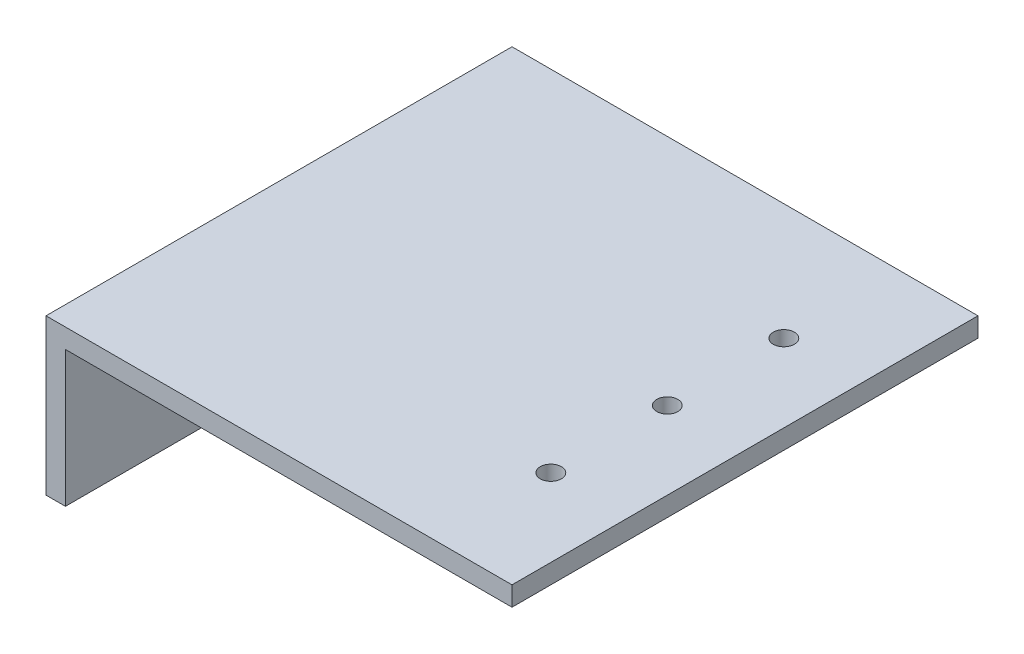
ISO-10303-21;
HEADER;
FILE_DESCRIPTION(('STEP AP214'),'2;1');
FILE_NAME('part.step','',(''),(''),'','','');
FILE_SCHEMA(('AUTOMOTIVE_DESIGN { 1 0 10303 214 1 1 1 1 }'));
ENDSEC;
DATA;
#1=APPLICATION_CONTEXT('core data for automotive mechanical design processes');
#2=APPLICATION_PROTOCOL_DEFINITION('international standard','automotive_design',2000,#1);
#3=PRODUCT_CONTEXT('',#1,'mechanical');
#4=PRODUCT('Part','Part','',(#3));
#5=PRODUCT_RELATED_PRODUCT_CATEGORY('part','',(#4));
#6=PRODUCT_DEFINITION_FORMATION('','',#4);
#7=PRODUCT_DEFINITION_CONTEXT('part definition',#1,'design');
#8=PRODUCT_DEFINITION('design','',#6,#7);
#9=PRODUCT_DEFINITION_SHAPE('','',#8);
#10=(LENGTH_UNIT() NAMED_UNIT(*) SI_UNIT(.MILLI.,.METRE.));
#11=(NAMED_UNIT(*) PLANE_ANGLE_UNIT() SI_UNIT($,.RADIAN.));
#12=(NAMED_UNIT(*) SI_UNIT($,.STERADIAN.) SOLID_ANGLE_UNIT());
#13=UNCERTAINTY_MEASURE_WITH_UNIT(LENGTH_MEASURE(1.E-05),#10,'distance_accuracy_value','');
#14=(GEOMETRIC_REPRESENTATION_CONTEXT(3) GLOBAL_UNCERTAINTY_ASSIGNED_CONTEXT((#13)) GLOBAL_UNIT_ASSIGNED_CONTEXT((#10,
#11,#12)) REPRESENTATION_CONTEXT('',''));
#15=CARTESIAN_POINT('',(0.,0.,0.));
#16=DIRECTION('',(0.,0.,1.));
#17=DIRECTION('',(1.,0.,0.));
#18=AXIS2_PLACEMENT_3D('',#15,#16,#17);
#19=CARTESIAN_POINT('',(0.,0.,76.2));
#20=DIRECTION('',(0.,-1.,0.));
#21=DIRECTION('',(1.,0.,0.));
#22=AXIS2_PLACEMENT_3D('',#19,#20,#21);
#23=PLANE('',#22);
#24=DIRECTION('',(-1.,0.,0.));
#25=VECTOR('',#24,1.);
#26=CARTESIAN_POINT('',(0.,0.,0.));
#27=LINE('',#26,#25);
#28=CARTESIAN_POINT('',(0.,0.,0.));
#29=VERTEX_POINT('',#28);
#30=CARTESIAN_POINT('',(-76.2,0.,0.));
#31=VERTEX_POINT('',#30);
#32=EDGE_CURVE('E120',#29,#31,#27,.T.);
#33=ORIENTED_EDGE('',*,*,#32,.T.);
#34=DIRECTION('',(0.,0.,-1.));
#35=VECTOR('',#34,1.);
#36=CARTESIAN_POINT('',(-76.2,0.,76.2));
#37=LINE('',#36,#35);
#38=CARTESIAN_POINT('',(-76.2,0.,76.2));
#39=VERTEX_POINT('',#38);
#40=EDGE_CURVE('E41',#39,#31,#37,.T.);
#41=ORIENTED_EDGE('',*,*,#40,.F.);
#42=DIRECTION('',(-1.,0.,0.));
#43=VECTOR('',#42,1.);
#44=CARTESIAN_POINT('',(0.,0.,76.2));
#45=LINE('',#44,#43);
#46=CARTESIAN_POINT('',(0.,0.,76.2));
#47=VERTEX_POINT('',#46);
#48=EDGE_CURVE('E86',#47,#39,#45,.T.);
#49=ORIENTED_EDGE('',*,*,#48,.F.);
#50=DIRECTION('',(0.,0.,-1.));
#51=VECTOR('',#50,1.);
#52=CARTESIAN_POINT('',(0.,0.,76.2));
#53=LINE('',#52,#51);
#54=EDGE_CURVE('E11',#47,#29,#53,.T.);
#55=ORIENTED_EDGE('',*,*,#54,.T.);
#56=EDGE_LOOP('',(#33,#41,#49,#55));
#57=FACE_BOUND('',#56,.T.);
#58=CARTESIAN_POINT('',(-12.7,0.,57.15));
#59=DIRECTION('',(0.,1.,0.));
#60=DIRECTION('',(0.,0.,1.));
#61=AXIS2_PLACEMENT_3D('',#58,#59,#60);
#62=CIRCLE('',#61,1.7272);
#63=CARTESIAN_POINT('',(-12.7,0.,58.8772));
#64=VERTEX_POINT('',#63);
#65=EDGE_CURVE('E278',#64,#64,#62,.T.);
#66=ORIENTED_EDGE('',*,*,#65,.F.);
#67=EDGE_LOOP('',(#66));
#68=FACE_BOUND('',#67,.T.);
#69=CARTESIAN_POINT('',(-12.7,0.,19.05));
#70=DIRECTION('',(0.,1.,0.));
#71=DIRECTION('',(0.,0.,1.));
#72=AXIS2_PLACEMENT_3D('',#69,#70,#71);
#73=CIRCLE('',#72,1.7272);
#74=CARTESIAN_POINT('',(-12.7,0.,20.7772));
#75=VERTEX_POINT('',#74);
#76=EDGE_CURVE('E284',#75,#75,#73,.T.);
#77=ORIENTED_EDGE('',*,*,#76,.F.);
#78=EDGE_LOOP('',(#77));
#79=FACE_BOUND('',#78,.T.);
#80=CARTESIAN_POINT('',(-12.7,0.,38.1));
#81=DIRECTION('',(0.,1.,0.));
#82=DIRECTION('',(0.,0.,1.));
#83=AXIS2_PLACEMENT_3D('',#80,#81,#82);
#84=CIRCLE('',#83,1.7272);
#85=CARTESIAN_POINT('',(-12.7,0.,39.8272));
#86=VERTEX_POINT('',#85);
#87=EDGE_CURVE('E289',#86,#86,#84,.T.);
#88=ORIENTED_EDGE('',*,*,#87,.F.);
#89=EDGE_LOOP('',(#88));
#90=FACE_BOUND('',#89,.T.);
#91=ADVANCED_FACE('F32',(#57,#68,#79,#90),#23,.F.);
#92=CARTESIAN_POINT('',(0.,-3.17500000000001,76.2));
#93=DIRECTION('',(-1.,0.,0.));
#94=DIRECTION('',(0.,0.,1.));
#95=AXIS2_PLACEMENT_3D('',#92,#93,#94);
#96=PLANE('',#95);
#97=DIRECTION('',(0.,1.,0.));
#98=VECTOR('',#97,1.);
#99=CARTESIAN_POINT('',(0.,-3.17500000000001,0.));
#100=LINE('',#99,#98);
#101=CARTESIAN_POINT('',(0.,-3.17500000000001,0.));
#102=VERTEX_POINT('',#101);
#103=EDGE_CURVE('E117',#102,#29,#100,.T.);
#104=ORIENTED_EDGE('',*,*,#103,.T.);
#105=ORIENTED_EDGE('',*,*,#54,.F.);
#106=DIRECTION('',(0.,1.,0.));
#107=VECTOR('',#106,1.);
#108=CARTESIAN_POINT('',(0.,-3.17500000000001,76.2));
#109=LINE('',#108,#107);
#110=CARTESIAN_POINT('',(0.,-3.17500000000001,76.2));
#111=VERTEX_POINT('',#110);
#112=EDGE_CURVE('E128',#111,#47,#109,.T.);
#113=ORIENTED_EDGE('',*,*,#112,.F.);
#114=DIRECTION('',(0.,0.,-1.));
#115=VECTOR('',#114,1.);
#116=CARTESIAN_POINT('',(0.,-3.17500000000001,76.2));
#117=LINE('',#116,#115);
#118=EDGE_CURVE('E113',#111,#102,#117,.T.);
#119=ORIENTED_EDGE('',*,*,#118,.T.);
#120=EDGE_LOOP('',(#104,#105,#113,#119));
#121=FACE_BOUND('',#120,.T.);
#122=ADVANCED_FACE('F34',(#121),#96,.F.);
#123=CARTESIAN_POINT('',(-76.2,0.,76.2));
#124=DIRECTION('',(1.,0.,0.));
#125=DIRECTION('',(0.,0.,-1.));
#126=AXIS2_PLACEMENT_3D('',#123,#124,#125);
#127=PLANE('',#126);
#128=CARTESIAN_POINT('',(-76.2,-15.24,25.4));
#129=DIRECTION('',(-1.,0.,0.));
#130=DIRECTION('',(0.,0.,1.));
#131=AXIS2_PLACEMENT_3D('',#128,#129,#130);
#132=CIRCLE('',#131,1.72719999999999);
#133=CARTESIAN_POINT('',(-76.2,-15.24,27.1272));
#134=VERTEX_POINT('',#133);
#135=EDGE_CURVE('E301',#134,#134,#132,.T.);
#136=ORIENTED_EDGE('',*,*,#135,.F.);
#137=EDGE_LOOP('',(#136));
#138=FACE_BOUND('',#137,.T.);
#139=CARTESIAN_POINT('',(-76.2,-15.24,50.8));
#140=DIRECTION('',(-1.,0.,0.));
#141=DIRECTION('',(0.,0.,1.));
#142=AXIS2_PLACEMENT_3D('',#139,#140,#141);
#143=CIRCLE('',#142,1.72719999999999);
#144=CARTESIAN_POINT('',(-76.2,-15.24,52.5272));
#145=VERTEX_POINT('',#144);
#146=EDGE_CURVE('E295',#145,#145,#143,.T.);
#147=ORIENTED_EDGE('',*,*,#146,.F.);
#148=EDGE_LOOP('',(#147));
#149=FACE_BOUND('',#148,.T.);
#150=CARTESIAN_POINT('',(-76.2,-15.24,38.1));
#151=DIRECTION('',(-1.,0.,0.));
#152=DIRECTION('',(0.,0.,1.));
#153=AXIS2_PLACEMENT_3D('',#150,#151,#152);
#154=CIRCLE('',#153,3.175);
#155=CARTESIAN_POINT('',(-76.2,-15.24,41.275));
#156=VERTEX_POINT('',#155);
#157=EDGE_CURVE('E266',#156,#156,#154,.T.);
#158=ORIENTED_EDGE('',*,*,#157,.F.);
#159=EDGE_LOOP('',(#158));
#160=FACE_BOUND('',#159,.T.);
#161=DIRECTION('',(0.,-1.,0.));
#162=VECTOR('',#161,1.);
#163=CARTESIAN_POINT('',(-76.2,0.,0.));
#164=LINE('',#163,#162);
#165=CARTESIAN_POINT('',(-76.2,-25.4,0.));
#166=VERTEX_POINT('',#165);
#167=EDGE_CURVE('E123',#31,#166,#164,.T.);
#168=ORIENTED_EDGE('',*,*,#167,.T.);
#169=DIRECTION('',(0.,0.,-1.));
#170=VECTOR('',#169,1.);
#171=CARTESIAN_POINT('',(-76.2,-25.4,76.2));
#172=LINE('',#171,#170);
#173=CARTESIAN_POINT('',(-76.2,-25.4,76.2));
#174=VERTEX_POINT('',#173);
#175=EDGE_CURVE('E108',#174,#166,#172,.T.);
#176=ORIENTED_EDGE('',*,*,#175,.F.);
#177=DIRECTION('',(0.,-1.,0.));
#178=VECTOR('',#177,1.);
#179=CARTESIAN_POINT('',(-76.2,0.,76.2));
#180=LINE('',#179,#178);
#181=EDGE_CURVE('E99',#39,#174,#180,.T.);
#182=ORIENTED_EDGE('',*,*,#181,.F.);
#183=ORIENTED_EDGE('',*,*,#40,.T.);
#184=EDGE_LOOP('',(#168,#176,#182,#183));
#185=FACE_BOUND('',#184,.T.);
#186=ADVANCED_FACE('F134',(#138,#149,#160,#185),#127,.F.);
#187=CARTESIAN_POINT('',(-76.2,-25.4,76.2));
#188=DIRECTION('',(0.,1.,0.));
#189=DIRECTION('',(0.,0.,1.));
#190=AXIS2_PLACEMENT_3D('',#187,#188,#189);
#191=PLANE('',#190);
#192=DIRECTION('',(1.,0.,0.));
#193=VECTOR('',#192,1.);
#194=CARTESIAN_POINT('',(-76.2,-25.4,0.));
#195=LINE('',#194,#193);
#196=CARTESIAN_POINT('',(-73.025,-25.4,0.));
#197=VERTEX_POINT('',#196);
#198=EDGE_CURVE('E107',#166,#197,#195,.T.);
#199=ORIENTED_EDGE('',*,*,#198,.T.);
#200=DIRECTION('',(0.,0.,-1.));
#201=VECTOR('',#200,1.);
#202=CARTESIAN_POINT('',(-73.025,-25.4,76.2));
#203=LINE('',#202,#201);
#204=CARTESIAN_POINT('',(-73.025,-25.4,76.2));
#205=VERTEX_POINT('',#204);
#206=EDGE_CURVE('E104',#205,#197,#203,.T.);
#207=ORIENTED_EDGE('',*,*,#206,.F.);
#208=DIRECTION('',(1.,0.,0.));
#209=VECTOR('',#208,1.);
#210=CARTESIAN_POINT('',(-76.2,-25.4,76.2));
#211=LINE('',#210,#209);
#212=EDGE_CURVE('E93',#174,#205,#211,.T.);
#213=ORIENTED_EDGE('',*,*,#212,.F.);
#214=ORIENTED_EDGE('',*,*,#175,.T.);
#215=EDGE_LOOP('',(#199,#207,#213,#214));
#216=FACE_BOUND('',#215,.T.);
#217=ADVANCED_FACE('F105',(#216),#191,.F.);
#218=CARTESIAN_POINT('',(-73.025,-25.4,76.2));
#219=DIRECTION('',(-1.,0.,0.));
#220=DIRECTION('',(0.,0.,1.));
#221=AXIS2_PLACEMENT_3D('',#218,#219,#220);
#222=PLANE('',#221);
#223=CARTESIAN_POINT('',(-73.025,-15.24,25.4));
#224=DIRECTION('',(-1.,0.,0.));
#225=DIRECTION('',(0.,0.,1.));
#226=AXIS2_PLACEMENT_3D('',#223,#224,#225);
#227=CIRCLE('',#226,1.72719999999999);
#228=CARTESIAN_POINT('',(-73.025,-15.24,27.1272));
#229=VERTEX_POINT('',#228);
#230=EDGE_CURVE('E298',#229,#229,#227,.T.);
#231=ORIENTED_EDGE('',*,*,#230,.T.);
#232=EDGE_LOOP('',(#231));
#233=FACE_BOUND('',#232,.T.);
#234=CARTESIAN_POINT('',(-73.025,-15.24,50.8));
#235=DIRECTION('',(-1.,0.,0.));
#236=DIRECTION('',(0.,0.,1.));
#237=AXIS2_PLACEMENT_3D('',#234,#235,#236);
#238=CIRCLE('',#237,1.72719999999999);
#239=CARTESIAN_POINT('',(-73.025,-15.24,52.5272));
#240=VERTEX_POINT('',#239);
#241=EDGE_CURVE('E292',#240,#240,#238,.T.);
#242=ORIENTED_EDGE('',*,*,#241,.T.);
#243=EDGE_LOOP('',(#242));
#244=FACE_BOUND('',#243,.T.);
#245=CARTESIAN_POINT('',(-73.025,-15.24,38.1));
#246=DIRECTION('',(-1.,0.,0.));
#247=DIRECTION('',(0.,0.,1.));
#248=AXIS2_PLACEMENT_3D('',#245,#246,#247);
#249=CIRCLE('',#248,3.175);
#250=CARTESIAN_POINT('',(-73.025,-15.24,41.275));
#251=VERTEX_POINT('',#250);
#252=EDGE_CURVE('E121',#251,#251,#249,.F.);
#253=ORIENTED_EDGE('',*,*,#252,.F.);
#254=EDGE_LOOP('',(#253));
#255=FACE_BOUND('',#254,.T.);
#256=DIRECTION('',(0.,1.,0.));
#257=VECTOR('',#256,1.);
#258=CARTESIAN_POINT('',(-73.025,-25.4,0.));
#259=LINE('',#258,#257);
#260=CARTESIAN_POINT('',(-73.025,-3.17500000000001,0.));
#261=VERTEX_POINT('',#260);
#262=EDGE_CURVE('E72',#197,#261,#259,.T.);
#263=ORIENTED_EDGE('',*,*,#262,.T.);
#264=DIRECTION('',(0.,0.,-1.));
#265=VECTOR('',#264,1.);
#266=CARTESIAN_POINT('',(-73.025,-3.17500000000001,76.2));
#267=LINE('',#266,#265);
#268=CARTESIAN_POINT('',(-73.025,-3.17500000000001,76.2));
#269=VERTEX_POINT('',#268);
#270=EDGE_CURVE('E109',#269,#261,#267,.T.);
#271=ORIENTED_EDGE('',*,*,#270,.F.);
#272=DIRECTION('',(0.,1.,0.));
#273=VECTOR('',#272,1.);
#274=CARTESIAN_POINT('',(-73.025,-25.4,76.2));
#275=LINE('',#274,#273);
#276=EDGE_CURVE('E97',#205,#269,#275,.T.);
#277=ORIENTED_EDGE('',*,*,#276,.F.);
#278=ORIENTED_EDGE('',*,*,#206,.T.);
#279=EDGE_LOOP('',(#263,#271,#277,#278));
#280=FACE_BOUND('',#279,.T.);
#281=ADVANCED_FACE('F111',(#233,#244,#255,#280),#222,.F.);
#282=CARTESIAN_POINT('',(-73.025,-3.17500000000001,76.2));
#283=DIRECTION('',(0.,1.,0.));
#284=DIRECTION('',(-1.,0.,0.));
#285=AXIS2_PLACEMENT_3D('',#282,#283,#284);
#286=PLANE('',#285);
#287=CARTESIAN_POINT('',(-12.7,-3.17500000000001,38.1));
#288=DIRECTION('',(0.,1.,0.));
#289=DIRECTION('',(-1.,0.,0.));
#290=AXIS2_PLACEMENT_3D('',#287,#288,#289);
#291=CIRCLE('',#290,1.7272);
#292=CARTESIAN_POINT('',(-14.4272,-3.17500000000001,38.1));
#293=VERTEX_POINT('',#292);
#294=EDGE_CURVE('E287',#293,#293,#291,.T.);
#295=ORIENTED_EDGE('',*,*,#294,.T.);
#296=EDGE_LOOP('',(#295));
#297=FACE_BOUND('',#296,.T.);
#298=CARTESIAN_POINT('',(-12.7,-3.17500000000001,19.05));
#299=DIRECTION('',(0.,1.,0.));
#300=DIRECTION('',(-1.,0.,0.));
#301=AXIS2_PLACEMENT_3D('',#298,#299,#300);
#302=CIRCLE('',#301,1.7272);
#303=CARTESIAN_POINT('',(-14.4272,-3.17500000000001,19.05));
#304=VERTEX_POINT('',#303);
#305=EDGE_CURVE('E281',#304,#304,#302,.T.);
#306=ORIENTED_EDGE('',*,*,#305,.T.);
#307=EDGE_LOOP('',(#306));
#308=FACE_BOUND('',#307,.T.);
#309=CARTESIAN_POINT('',(-12.7,-3.17500000000001,57.15));
#310=DIRECTION('',(0.,1.,0.));
#311=DIRECTION('',(-1.,0.,0.));
#312=AXIS2_PLACEMENT_3D('',#309,#310,#311);
#313=CIRCLE('',#312,1.7272);
#314=CARTESIAN_POINT('',(-14.4272,-3.17500000000001,57.15));
#315=VERTEX_POINT('',#314);
#316=EDGE_CURVE('E271',#315,#315,#313,.T.);
#317=ORIENTED_EDGE('',*,*,#316,.T.);
#318=EDGE_LOOP('',(#317));
#319=FACE_BOUND('',#318,.T.);
#320=DIRECTION('',(1.,0.,0.));
#321=VECTOR('',#320,1.);
#322=CARTESIAN_POINT('',(-73.025,-3.17500000000001,0.));
#323=LINE('',#322,#321);
#324=EDGE_CURVE('E78',#261,#102,#323,.T.);
#325=ORIENTED_EDGE('',*,*,#324,.T.);
#326=ORIENTED_EDGE('',*,*,#118,.F.);
#327=DIRECTION('',(1.,0.,0.));
#328=VECTOR('',#327,1.);
#329=CARTESIAN_POINT('',(-73.025,-3.17500000000001,76.2));
#330=LINE('',#329,#328);
#331=EDGE_CURVE('E49',#269,#111,#330,.T.);
#332=ORIENTED_EDGE('',*,*,#331,.F.);
#333=ORIENTED_EDGE('',*,*,#270,.T.);
#334=EDGE_LOOP('',(#325,#326,#332,#333));
#335=FACE_BOUND('',#334,.T.);
#336=ADVANCED_FACE('F141',(#297,#308,#319,#335),#286,.F.);
#337=CARTESIAN_POINT('',(0.,0.,76.2));
#338=DIRECTION('',(0.,0.,1.));
#339=DIRECTION('',(1.,0.,0.));
#340=AXIS2_PLACEMENT_3D('',#337,#338,#339);
#341=PLANE('',#340);
#342=ORIENTED_EDGE('',*,*,#112,.T.);
#343=ORIENTED_EDGE('',*,*,#48,.T.);
#344=ORIENTED_EDGE('',*,*,#181,.T.);
#345=ORIENTED_EDGE('',*,*,#212,.T.);
#346=ORIENTED_EDGE('',*,*,#276,.T.);
#347=ORIENTED_EDGE('',*,*,#331,.T.);
#348=EDGE_LOOP('',(#342,#343,#344,#345,#346,#347));
#349=FACE_BOUND('',#348,.T.);
#350=ADVANCED_FACE('F95',(#349),#341,.T.);
#351=CARTESIAN_POINT('',(0.,0.,0.));
#352=DIRECTION('',(0.,0.,1.));
#353=DIRECTION('',(1.,0.,0.));
#354=AXIS2_PLACEMENT_3D('',#351,#352,#353);
#355=PLANE('',#354);
#356=ORIENTED_EDGE('',*,*,#103,.F.);
#357=ORIENTED_EDGE('',*,*,#324,.F.);
#358=ORIENTED_EDGE('',*,*,#262,.F.);
#359=ORIENTED_EDGE('',*,*,#198,.F.);
#360=ORIENTED_EDGE('',*,*,#167,.F.);
#361=ORIENTED_EDGE('',*,*,#32,.F.);
#362=EDGE_LOOP('',(#356,#357,#358,#359,#360,#361));
#363=FACE_BOUND('',#362,.T.);
#364=ADVANCED_FACE('F137',(#363),#355,.F.);
#365=CARTESIAN_POINT('',(0.001000000000001,-15.24,38.1));
#366=DIRECTION('',(-1.,0.,0.));
#367=DIRECTION('',(0.,0.,1.));
#368=AXIS2_PLACEMENT_3D('',#365,#366,#367);
#369=CYLINDRICAL_SURFACE('',#368,3.175);
#370=ORIENTED_EDGE('',*,*,#157,.T.);
#371=EDGE_LOOP('',(#370));
#372=FACE_BOUND('',#371,.T.);
#373=ORIENTED_EDGE('',*,*,#252,.T.);
#374=EDGE_LOOP('',(#373));
#375=FACE_BOUND('',#374,.T.);
#376=ADVANCED_FACE('F218',(#372,#375),#369,.F.);
#377=CARTESIAN_POINT('',(-12.7,0.,57.15));
#378=DIRECTION('',(0.,1.,0.));
#379=DIRECTION('',(0.,0.,1.));
#380=AXIS2_PLACEMENT_3D('',#377,#378,#379);
#381=CYLINDRICAL_SURFACE('',#380,1.7272);
#382=ORIENTED_EDGE('',*,*,#316,.F.);
#383=EDGE_LOOP('',(#382));
#384=FACE_BOUND('',#383,.T.);
#385=ORIENTED_EDGE('',*,*,#65,.T.);
#386=EDGE_LOOP('',(#385));
#387=FACE_BOUND('',#386,.T.);
#388=ADVANCED_FACE('F214',(#384,#387),#381,.F.);
#389=CARTESIAN_POINT('',(-12.7,0.,19.05));
#390=DIRECTION('',(0.,1.,0.));
#391=DIRECTION('',(0.,0.,1.));
#392=AXIS2_PLACEMENT_3D('',#389,#390,#391);
#393=CYLINDRICAL_SURFACE('',#392,1.7272);
#394=ORIENTED_EDGE('',*,*,#305,.F.);
#395=EDGE_LOOP('',(#394));
#396=FACE_BOUND('',#395,.T.);
#397=ORIENTED_EDGE('',*,*,#76,.T.);
#398=EDGE_LOOP('',(#397));
#399=FACE_BOUND('',#398,.T.);
#400=ADVANCED_FACE('F210',(#396,#399),#393,.F.);
#401=CARTESIAN_POINT('',(-12.7,0.,38.1));
#402=DIRECTION('',(0.,1.,0.));
#403=DIRECTION('',(0.,0.,1.));
#404=AXIS2_PLACEMENT_3D('',#401,#402,#403);
#405=CYLINDRICAL_SURFACE('',#404,1.7272);
#406=ORIENTED_EDGE('',*,*,#294,.F.);
#407=EDGE_LOOP('',(#406));
#408=FACE_BOUND('',#407,.T.);
#409=ORIENTED_EDGE('',*,*,#87,.T.);
#410=EDGE_LOOP('',(#409));
#411=FACE_BOUND('',#410,.T.);
#412=ADVANCED_FACE('F190',(#408,#411),#405,.F.);
#413=CARTESIAN_POINT('',(-76.2,-15.24,50.8));
#414=DIRECTION('',(-1.,0.,0.));
#415=DIRECTION('',(0.,0.,1.));
#416=AXIS2_PLACEMENT_3D('',#413,#414,#415);
#417=CYLINDRICAL_SURFACE('',#416,1.72719999999999);
#418=ORIENTED_EDGE('',*,*,#241,.F.);
#419=EDGE_LOOP('',(#418));
#420=FACE_BOUND('',#419,.T.);
#421=ORIENTED_EDGE('',*,*,#146,.T.);
#422=EDGE_LOOP('',(#421));
#423=FACE_BOUND('',#422,.T.);
#424=ADVANCED_FACE('F184',(#420,#423),#417,.F.);
#425=CARTESIAN_POINT('',(-76.2,-15.24,25.4));
#426=DIRECTION('',(-1.,0.,0.));
#427=DIRECTION('',(0.,0.,1.));
#428=AXIS2_PLACEMENT_3D('',#425,#426,#427);
#429=CYLINDRICAL_SURFACE('',#428,1.72719999999999);
#430=ORIENTED_EDGE('',*,*,#230,.F.);
#431=EDGE_LOOP('',(#430));
#432=FACE_BOUND('',#431,.T.);
#433=ORIENTED_EDGE('',*,*,#135,.T.);
#434=EDGE_LOOP('',(#433));
#435=FACE_BOUND('',#434,.T.);
#436=ADVANCED_FACE('F189',(#432,#435),#429,.F.);
#437=CLOSED_SHELL('',(#91,#122,#186,#217,#281,#336,#350,#364,#376,#388,#400,#412,#424,#436));
#438=MANIFOLD_SOLID_BREP('B2',#437);
#439=ADVANCED_BREP_SHAPE_REPRESENTATION('',(#18,#438),#14);
#440=SHAPE_DEFINITION_REPRESENTATION(#9,#439);
ENDSEC;
END-ISO-10303-21;
